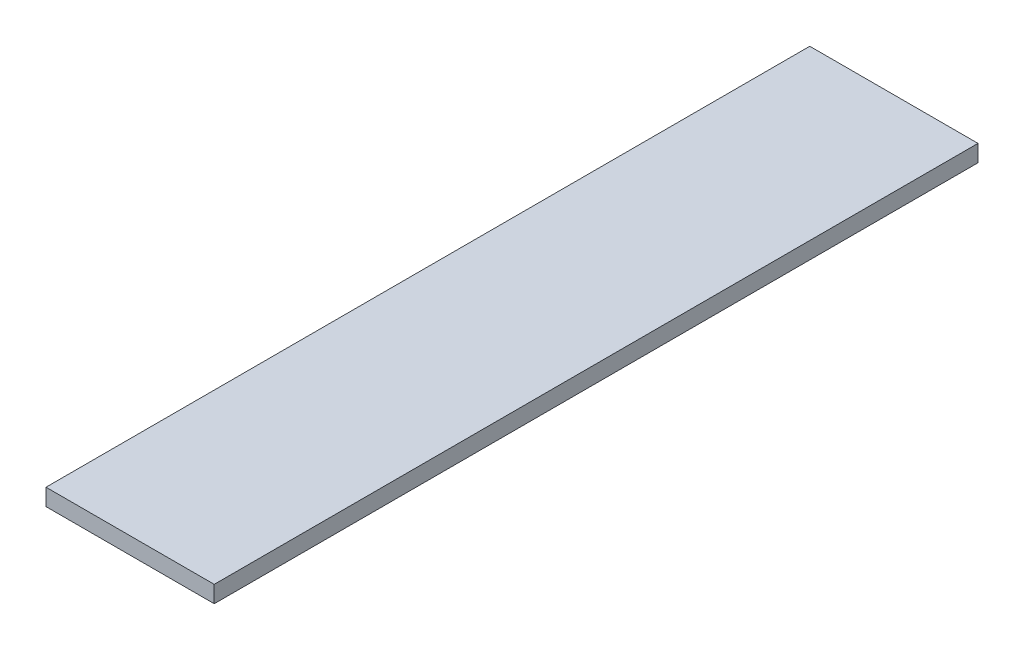
ISO-10303-21;
HEADER;
FILE_DESCRIPTION(('STEP AP214'),'2;1');
FILE_NAME('part.step','',(''),(''),'','','');
FILE_SCHEMA(('AUTOMOTIVE_DESIGN { 1 0 10303 214 1 1 1 1 }'));
ENDSEC;
DATA;
#1=APPLICATION_CONTEXT('core data for automotive mechanical design processes');
#2=APPLICATION_PROTOCOL_DEFINITION('international standard','automotive_design',2000,#1);
#3=PRODUCT_CONTEXT('',#1,'mechanical');
#4=PRODUCT('Part','Part','',(#3));
#5=PRODUCT_RELATED_PRODUCT_CATEGORY('part','',(#4));
#6=PRODUCT_DEFINITION_FORMATION('','',#4);
#7=PRODUCT_DEFINITION_CONTEXT('part definition',#1,'design');
#8=PRODUCT_DEFINITION('design','',#6,#7);
#9=PRODUCT_DEFINITION_SHAPE('','',#8);
#10=(LENGTH_UNIT() NAMED_UNIT(*) SI_UNIT(.MILLI.,.METRE.));
#11=(NAMED_UNIT(*) PLANE_ANGLE_UNIT() SI_UNIT($,.RADIAN.));
#12=(NAMED_UNIT(*) SI_UNIT($,.STERADIAN.) SOLID_ANGLE_UNIT());
#13=UNCERTAINTY_MEASURE_WITH_UNIT(LENGTH_MEASURE(1.E-05),#10,'distance_accuracy_value','');
#14=(GEOMETRIC_REPRESENTATION_CONTEXT(3) GLOBAL_UNCERTAINTY_ASSIGNED_CONTEXT((#13)) GLOBAL_UNIT_ASSIGNED_CONTEXT((#10,
#11,#12)) REPRESENTATION_CONTEXT('',''));
#15=CARTESIAN_POINT('',(0.,0.,0.));
#16=DIRECTION('',(0.,0.,1.));
#17=DIRECTION('',(1.,0.,0.));
#18=AXIS2_PLACEMENT_3D('',#15,#16,#17);
#19=CARTESIAN_POINT('',(0.,0.,288.29));
#20=DIRECTION('',(1.,0.,0.));
#21=DIRECTION('',(0.,0.,-1.));
#22=AXIS2_PLACEMENT_3D('',#19,#20,#21);
#23=PLANE('',#22);
#24=DIRECTION('',(0.,-1.,0.));
#25=VECTOR('',#24,1.);
#26=CARTESIAN_POINT('',(0.,0.,0.));
#27=LINE('',#26,#25);
#28=CARTESIAN_POINT('',(0.,6.35,0.));
#29=VERTEX_POINT('',#28);
#30=CARTESIAN_POINT('',(0.,0.,0.));
#31=VERTEX_POINT('',#30);
#32=EDGE_CURVE('E107',#29,#31,#27,.T.);
#33=ORIENTED_EDGE('',*,*,#32,.T.);
#34=DIRECTION('',(0.,0.,-1.));
#35=VECTOR('',#34,1.);
#36=CARTESIAN_POINT('',(0.,0.,288.29));
#37=LINE('',#36,#35);
#38=CARTESIAN_POINT('',(0.,0.,288.29));
#39=VERTEX_POINT('',#38);
#40=EDGE_CURVE('E11',#39,#31,#37,.T.);
#41=ORIENTED_EDGE('',*,*,#40,.F.);
#42=DIRECTION('',(0.,-1.,0.));
#43=VECTOR('',#42,1.);
#44=CARTESIAN_POINT('',(0.,0.,288.29));
#45=LINE('',#44,#43);
#46=CARTESIAN_POINT('',(0.,6.35,288.29));
#47=VERTEX_POINT('',#46);
#48=EDGE_CURVE('E91',#47,#39,#45,.T.);
#49=ORIENTED_EDGE('',*,*,#48,.F.);
#50=DIRECTION('',(0.,0.,-1.));
#51=VECTOR('',#50,1.);
#52=CARTESIAN_POINT('',(0.,6.35,288.29));
#53=LINE('',#52,#51);
#54=EDGE_CURVE('E103',#47,#29,#53,.T.);
#55=ORIENTED_EDGE('',*,*,#54,.T.);
#56=EDGE_LOOP('',(#33,#41,#49,#55));
#57=FACE_BOUND('',#56,.T.);
#58=ADVANCED_FACE('F39',(#57),#23,.F.);
#59=CARTESIAN_POINT('',(0.,0.,288.29));
#60=DIRECTION('',(0.,1.,0.));
#61=DIRECTION('',(0.,0.,1.));
#62=AXIS2_PLACEMENT_3D('',#59,#60,#61);
#63=PLANE('',#62);
#64=DIRECTION('',(1.,0.,0.));
#65=VECTOR('',#64,1.);
#66=CARTESIAN_POINT('',(0.,0.,0.));
#67=LINE('',#66,#65);
#68=CARTESIAN_POINT('',(63.5,0.,0.));
#69=VERTEX_POINT('',#68);
#70=EDGE_CURVE('E96',#31,#69,#67,.T.);
#71=ORIENTED_EDGE('',*,*,#70,.T.);
#72=DIRECTION('',(0.,0.,-1.));
#73=VECTOR('',#72,1.);
#74=CARTESIAN_POINT('',(63.5,0.,288.29));
#75=LINE('',#74,#73);
#76=CARTESIAN_POINT('',(63.5,0.,288.29));
#77=VERTEX_POINT('',#76);
#78=EDGE_CURVE('E48',#77,#69,#75,.T.);
#79=ORIENTED_EDGE('',*,*,#78,.F.);
#80=DIRECTION('',(1.,0.,0.));
#81=VECTOR('',#80,1.);
#82=CARTESIAN_POINT('',(0.,0.,288.29));
#83=LINE('',#82,#81);
#84=EDGE_CURVE('E86',#39,#77,#83,.T.);
#85=ORIENTED_EDGE('',*,*,#84,.F.);
#86=ORIENTED_EDGE('',*,*,#40,.T.);
#87=EDGE_LOOP('',(#71,#79,#85,#86));
#88=FACE_BOUND('',#87,.T.);
#89=ADVANCED_FACE('F95',(#88),#63,.F.);
#90=CARTESIAN_POINT('',(63.5,0.,288.29));
#91=DIRECTION('',(-1.,0.,0.));
#92=DIRECTION('',(0.,0.,1.));
#93=AXIS2_PLACEMENT_3D('',#90,#91,#92);
#94=PLANE('',#93);
#95=DIRECTION('',(0.,1.,0.));
#96=VECTOR('',#95,1.);
#97=CARTESIAN_POINT('',(63.5,0.,0.));
#98=LINE('',#97,#96);
#99=CARTESIAN_POINT('',(63.5,6.35,0.));
#100=VERTEX_POINT('',#99);
#101=EDGE_CURVE('E73',#69,#100,#98,.T.);
#102=ORIENTED_EDGE('',*,*,#101,.T.);
#103=DIRECTION('',(0.,0.,-1.));
#104=VECTOR('',#103,1.);
#105=CARTESIAN_POINT('',(63.5,6.35,288.29));
#106=LINE('',#105,#104);
#107=CARTESIAN_POINT('',(63.5,6.35,288.29));
#108=VERTEX_POINT('',#107);
#109=EDGE_CURVE('E98',#108,#100,#106,.T.);
#110=ORIENTED_EDGE('',*,*,#109,.F.);
#111=DIRECTION('',(0.,1.,0.));
#112=VECTOR('',#111,1.);
#113=CARTESIAN_POINT('',(63.5,0.,288.29));
#114=LINE('',#113,#112);
#115=EDGE_CURVE('E89',#77,#108,#114,.T.);
#116=ORIENTED_EDGE('',*,*,#115,.F.);
#117=ORIENTED_EDGE('',*,*,#78,.T.);
#118=EDGE_LOOP('',(#102,#110,#116,#117));
#119=FACE_BOUND('',#118,.T.);
#120=ADVANCED_FACE('F99',(#119),#94,.F.);
#121=CARTESIAN_POINT('',(0.,6.35,288.29));
#122=DIRECTION('',(0.,-1.,0.));
#123=DIRECTION('',(0.,0.,-1.));
#124=AXIS2_PLACEMENT_3D('',#121,#122,#123);
#125=PLANE('',#124);
#126=DIRECTION('',(-1.,0.,0.));
#127=VECTOR('',#126,1.);
#128=CARTESIAN_POINT('',(0.,6.35,0.));
#129=LINE('',#128,#127);
#130=EDGE_CURVE('E79',#100,#29,#129,.T.);
#131=ORIENTED_EDGE('',*,*,#130,.T.);
#132=ORIENTED_EDGE('',*,*,#54,.F.);
#133=DIRECTION('',(-1.,0.,0.));
#134=VECTOR('',#133,1.);
#135=CARTESIAN_POINT('',(0.,6.35,288.29));
#136=LINE('',#135,#134);
#137=EDGE_CURVE('E56',#108,#47,#136,.T.);
#138=ORIENTED_EDGE('',*,*,#137,.F.);
#139=ORIENTED_EDGE('',*,*,#109,.T.);
#140=EDGE_LOOP('',(#131,#132,#138,#139));
#141=FACE_BOUND('',#140,.T.);
#142=ADVANCED_FACE('F120',(#141),#125,.F.);
#143=CARTESIAN_POINT('',(0.,0.,288.29));
#144=DIRECTION('',(0.,0.,-1.));
#145=DIRECTION('',(-1.,0.,0.));
#146=AXIS2_PLACEMENT_3D('',#143,#144,#145);
#147=PLANE('',#146);
#148=ORIENTED_EDGE('',*,*,#48,.T.);
#149=ORIENTED_EDGE('',*,*,#84,.T.);
#150=ORIENTED_EDGE('',*,*,#115,.T.);
#151=ORIENTED_EDGE('',*,*,#137,.T.);
#152=EDGE_LOOP('',(#148,#149,#150,#151));
#153=FACE_BOUND('',#152,.T.);
#154=ADVANCED_FACE('F87',(#153),#147,.F.);
#155=CARTESIAN_POINT('',(0.,0.,0.));
#156=DIRECTION('',(0.,0.,-1.));
#157=DIRECTION('',(-1.,0.,0.));
#158=AXIS2_PLACEMENT_3D('',#155,#156,#157);
#159=PLANE('',#158);
#160=ORIENTED_EDGE('',*,*,#32,.F.);
#161=ORIENTED_EDGE('',*,*,#130,.F.);
#162=ORIENTED_EDGE('',*,*,#101,.F.);
#163=ORIENTED_EDGE('',*,*,#70,.F.);
#164=EDGE_LOOP('',(#160,#161,#162,#163));
#165=FACE_BOUND('',#164,.T.);
#166=ADVANCED_FACE('F123',(#165),#159,.T.);
#167=CLOSED_SHELL('',(#58,#89,#120,#142,#154,#166));
#168=MANIFOLD_SOLID_BREP('B2',#167);
#169=ADVANCED_BREP_SHAPE_REPRESENTATION('',(#18,#168),#14);
#170=SHAPE_DEFINITION_REPRESENTATION(#9,#169);
ENDSEC;
END-ISO-10303-21;
